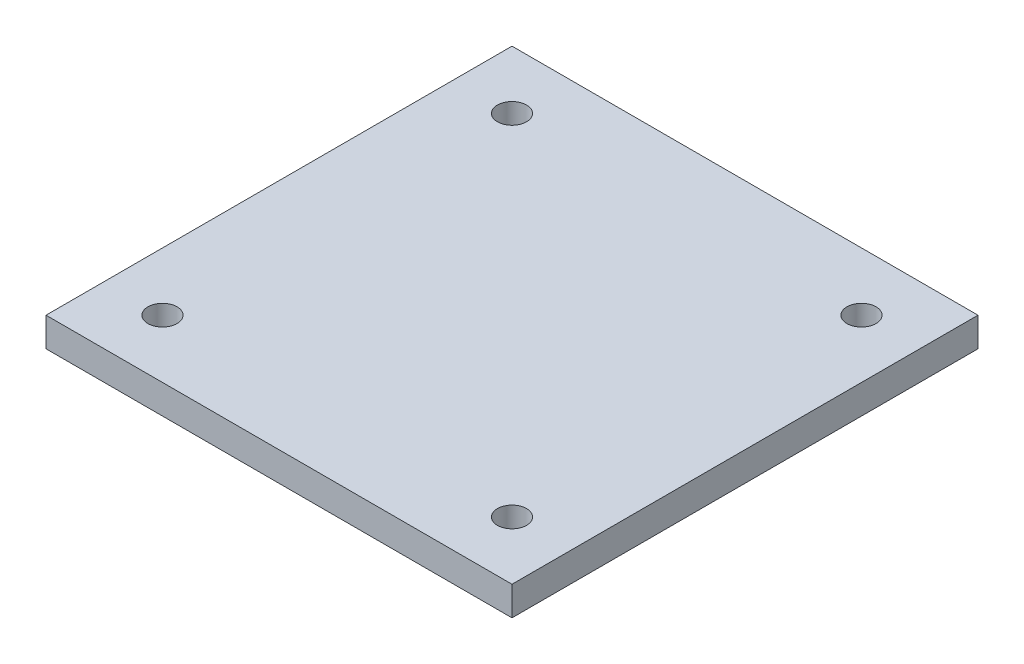
ISO-10303-21;
HEADER;
FILE_DESCRIPTION(('STEP AP214'),'2;1');
FILE_NAME('part.step','',(''),(''),'','','');
FILE_SCHEMA(('AUTOMOTIVE_DESIGN { 1 0 10303 214 1 1 1 1 }'));
ENDSEC;
DATA;
#1=APPLICATION_CONTEXT('core data for automotive mechanical design processes');
#2=APPLICATION_PROTOCOL_DEFINITION('international standard','automotive_design',2000,#1);
#3=PRODUCT_CONTEXT('',#1,'mechanical');
#4=PRODUCT('Part','Part','',(#3));
#5=PRODUCT_RELATED_PRODUCT_CATEGORY('part','',(#4));
#6=PRODUCT_DEFINITION_FORMATION('','',#4);
#7=PRODUCT_DEFINITION_CONTEXT('part definition',#1,'design');
#8=PRODUCT_DEFINITION('design','',#6,#7);
#9=PRODUCT_DEFINITION_SHAPE('','',#8);
#10=(LENGTH_UNIT() NAMED_UNIT(*) SI_UNIT(.MILLI.,.METRE.));
#11=(NAMED_UNIT(*) PLANE_ANGLE_UNIT() SI_UNIT($,.RADIAN.));
#12=(NAMED_UNIT(*) SI_UNIT($,.STERADIAN.) SOLID_ANGLE_UNIT());
#13=UNCERTAINTY_MEASURE_WITH_UNIT(LENGTH_MEASURE(1.E-05),#10,'distance_accuracy_value','');
#14=(GEOMETRIC_REPRESENTATION_CONTEXT(3) GLOBAL_UNCERTAINTY_ASSIGNED_CONTEXT((#13)) GLOBAL_UNIT_ASSIGNED_CONTEXT((#10,
#11,#12)) REPRESENTATION_CONTEXT('',''));
#15=CARTESIAN_POINT('',(0.,0.,0.));
#16=DIRECTION('',(0.,0.,1.));
#17=DIRECTION('',(1.,0.,0.));
#18=AXIS2_PLACEMENT_3D('',#15,#16,#17);
#19=CARTESIAN_POINT('',(0.,6.35,0.));
#20=DIRECTION('',(0.,-1.,0.));
#21=DIRECTION('',(0.,0.,-1.));
#22=AXIS2_PLACEMENT_3D('',#19,#20,#21);
#23=PLANE('',#22);
#24=DIRECTION('',(0.,0.,-1.));
#25=VECTOR('',#24,1.);
#26=CARTESIAN_POINT('',(50.8,6.35,50.8));
#27=LINE('',#26,#25);
#28=CARTESIAN_POINT('',(50.8,6.35,50.8));
#29=VERTEX_POINT('',#28);
#30=CARTESIAN_POINT('',(50.8,6.35,-50.8));
#31=VERTEX_POINT('',#30);
#32=EDGE_CURVE('E85',#29,#31,#27,.T.);
#33=ORIENTED_EDGE('',*,*,#32,.T.);
#34=DIRECTION('',(-1.,0.,0.));
#35=VECTOR('',#34,1.);
#36=CARTESIAN_POINT('',(-50.8,6.35,-50.8));
#37=LINE('',#36,#35);
#38=CARTESIAN_POINT('',(-50.8,6.35,-50.8));
#39=VERTEX_POINT('',#38);
#40=EDGE_CURVE('E80',#31,#39,#37,.T.);
#41=ORIENTED_EDGE('',*,*,#40,.T.);
#42=DIRECTION('',(0.,0.,1.));
#43=VECTOR('',#42,1.);
#44=CARTESIAN_POINT('',(-50.8,6.35,50.8));
#45=LINE('',#44,#43);
#46=CARTESIAN_POINT('',(-50.8,6.35,50.8));
#47=VERTEX_POINT('',#46);
#48=EDGE_CURVE('E83',#39,#47,#45,.T.);
#49=ORIENTED_EDGE('',*,*,#48,.T.);
#50=DIRECTION('',(1.,0.,0.));
#51=VECTOR('',#50,1.);
#52=CARTESIAN_POINT('',(-50.8,6.35,50.8));
#53=LINE('',#52,#51);
#54=EDGE_CURVE('E50',#47,#29,#53,.T.);
#55=ORIENTED_EDGE('',*,*,#54,.T.);
#56=EDGE_LOOP('',(#33,#41,#49,#55));
#57=FACE_BOUND('',#56,.T.);
#58=CARTESIAN_POINT('',(-38.1,6.35,-38.1));
#59=DIRECTION('',(0.,1.,0.));
#60=DIRECTION('',(0.,0.,1.));
#61=AXIS2_PLACEMENT_3D('',#58,#59,#60);
#62=CIRCLE('',#61,3.175);
#63=CARTESIAN_POINT('',(-38.1,6.35,-34.925));
#64=VERTEX_POINT('',#63);
#65=EDGE_CURVE('E100',#64,#64,#62,.T.);
#66=ORIENTED_EDGE('',*,*,#65,.F.);
#67=EDGE_LOOP('',(#66));
#68=FACE_BOUND('',#67,.T.);
#69=CARTESIAN_POINT('',(38.1,6.35,-38.1));
#70=DIRECTION('',(0.,1.,0.));
#71=DIRECTION('',(0.,0.,1.));
#72=AXIS2_PLACEMENT_3D('',#69,#70,#71);
#73=CIRCLE('',#72,3.175);
#74=CARTESIAN_POINT('',(38.1,6.35,-34.925));
#75=VERTEX_POINT('',#74);
#76=EDGE_CURVE('E115',#75,#75,#73,.T.);
#77=ORIENTED_EDGE('',*,*,#76,.F.);
#78=EDGE_LOOP('',(#77));
#79=FACE_BOUND('',#78,.T.);
#80=CARTESIAN_POINT('',(38.1000000000008,6.35,38.1));
#81=DIRECTION('',(0.,1.,0.));
#82=DIRECTION('',(0.,0.,1.));
#83=AXIS2_PLACEMENT_3D('',#80,#81,#82);
#84=CIRCLE('',#83,3.175);
#85=CARTESIAN_POINT('',(38.1000000000008,6.35,41.275));
#86=VERTEX_POINT('',#85);
#87=EDGE_CURVE('E121',#86,#86,#84,.T.);
#88=ORIENTED_EDGE('',*,*,#87,.F.);
#89=EDGE_LOOP('',(#88));
#90=FACE_BOUND('',#89,.T.);
#91=CARTESIAN_POINT('',(-38.0999999999992,6.35,38.1));
#92=DIRECTION('',(0.,1.,0.));
#93=DIRECTION('',(0.,0.,1.));
#94=AXIS2_PLACEMENT_3D('',#91,#92,#93);
#95=CIRCLE('',#94,3.175);
#96=CARTESIAN_POINT('',(-38.0999999999992,6.35,41.275));
#97=VERTEX_POINT('',#96);
#98=EDGE_CURVE('E127',#97,#97,#95,.T.);
#99=ORIENTED_EDGE('',*,*,#98,.F.);
#100=EDGE_LOOP('',(#99));
#101=FACE_BOUND('',#100,.T.);
#102=ADVANCED_FACE('F33',(#57,#68,#79,#90,#101),#23,.F.);
#103=CARTESIAN_POINT('',(0.,0.,0.));
#104=DIRECTION('',(0.,-1.,0.));
#105=DIRECTION('',(0.,0.,-1.));
#106=AXIS2_PLACEMENT_3D('',#103,#104,#105);
#107=PLANE('',#106);
#108=CARTESIAN_POINT('',(38.1000000000008,0.,38.1));
#109=DIRECTION('',(0.,1.,0.));
#110=DIRECTION('',(0.,0.,1.));
#111=AXIS2_PLACEMENT_3D('',#108,#109,#110);
#112=CIRCLE('',#111,3.175);
#113=CARTESIAN_POINT('',(38.1000000000008,0.,41.275));
#114=VERTEX_POINT('',#113);
#115=EDGE_CURVE('E124',#114,#114,#112,.T.);
#116=ORIENTED_EDGE('',*,*,#115,.T.);
#117=EDGE_LOOP('',(#116));
#118=FACE_BOUND('',#117,.T.);
#119=CARTESIAN_POINT('',(-38.1,0.,-38.1));
#120=DIRECTION('',(0.,1.,0.));
#121=DIRECTION('',(0.,0.,1.));
#122=AXIS2_PLACEMENT_3D('',#119,#120,#121);
#123=CIRCLE('',#122,3.175);
#124=CARTESIAN_POINT('',(-38.1,0.,-34.925));
#125=VERTEX_POINT('',#124);
#126=EDGE_CURVE('E112',#125,#125,#123,.T.);
#127=ORIENTED_EDGE('',*,*,#126,.T.);
#128=EDGE_LOOP('',(#127));
#129=FACE_BOUND('',#128,.T.);
#130=DIRECTION('',(0.,0.,-1.));
#131=VECTOR('',#130,1.);
#132=CARTESIAN_POINT('',(50.8,0.,50.8));
#133=LINE('',#132,#131);
#134=CARTESIAN_POINT('',(50.8,0.,50.8));
#135=VERTEX_POINT('',#134);
#136=CARTESIAN_POINT('',(50.8,0.,-50.8));
#137=VERTEX_POINT('',#136);
#138=EDGE_CURVE('E97',#135,#137,#133,.T.);
#139=ORIENTED_EDGE('',*,*,#138,.F.);
#140=DIRECTION('',(1.,0.,0.));
#141=VECTOR('',#140,1.);
#142=CARTESIAN_POINT('',(-50.8,0.,50.8));
#143=LINE('',#142,#141);
#144=CARTESIAN_POINT('',(-50.8,0.,50.8));
#145=VERTEX_POINT('',#144);
#146=EDGE_CURVE('E73',#145,#135,#143,.T.);
#147=ORIENTED_EDGE('',*,*,#146,.F.);
#148=DIRECTION('',(0.,0.,1.));
#149=VECTOR('',#148,1.);
#150=CARTESIAN_POINT('',(-50.8,0.,50.8));
#151=LINE('',#150,#149);
#152=CARTESIAN_POINT('',(-50.8,0.,-50.8));
#153=VERTEX_POINT('',#152);
#154=EDGE_CURVE('E67',#153,#145,#151,.T.);
#155=ORIENTED_EDGE('',*,*,#154,.F.);
#156=DIRECTION('',(-1.,0.,0.));
#157=VECTOR('',#156,1.);
#158=CARTESIAN_POINT('',(-50.8,0.,-50.8));
#159=LINE('',#158,#157);
#160=EDGE_CURVE('E89',#137,#153,#159,.T.);
#161=ORIENTED_EDGE('',*,*,#160,.F.);
#162=EDGE_LOOP('',(#139,#147,#155,#161));
#163=FACE_BOUND('',#162,.T.);
#164=CARTESIAN_POINT('',(38.1,0.,-38.1));
#165=DIRECTION('',(0.,1.,0.));
#166=DIRECTION('',(0.,0.,1.));
#167=AXIS2_PLACEMENT_3D('',#164,#165,#166);
#168=CIRCLE('',#167,3.175);
#169=CARTESIAN_POINT('',(38.1,0.,-34.925));
#170=VERTEX_POINT('',#169);
#171=EDGE_CURVE('E118',#170,#170,#168,.T.);
#172=ORIENTED_EDGE('',*,*,#171,.T.);
#173=EDGE_LOOP('',(#172));
#174=FACE_BOUND('',#173,.T.);
#175=CARTESIAN_POINT('',(-38.0999999999992,0.,38.1));
#176=DIRECTION('',(0.,1.,0.));
#177=DIRECTION('',(0.,0.,1.));
#178=AXIS2_PLACEMENT_3D('',#175,#176,#177);
#179=CIRCLE('',#178,3.175);
#180=CARTESIAN_POINT('',(-38.0999999999992,0.,41.275));
#181=VERTEX_POINT('',#180);
#182=EDGE_CURVE('E130',#181,#181,#179,.T.);
#183=ORIENTED_EDGE('',*,*,#182,.T.);
#184=EDGE_LOOP('',(#183));
#185=FACE_BOUND('',#184,.T.);
#186=ADVANCED_FACE('F108',(#118,#129,#163,#174,#185),#107,.T.);
#187=CARTESIAN_POINT('',(50.8,6.35,50.8));
#188=DIRECTION('',(-1.,0.,0.));
#189=DIRECTION('',(0.,0.,1.));
#190=AXIS2_PLACEMENT_3D('',#187,#188,#189);
#191=PLANE('',#190);
#192=ORIENTED_EDGE('',*,*,#138,.T.);
#193=DIRECTION('',(0.,-1.,0.));
#194=VECTOR('',#193,1.);
#195=CARTESIAN_POINT('',(50.8,6.35,-50.8));
#196=LINE('',#195,#194);
#197=EDGE_CURVE('E11',#31,#137,#196,.T.);
#198=ORIENTED_EDGE('',*,*,#197,.F.);
#199=ORIENTED_EDGE('',*,*,#32,.F.);
#200=DIRECTION('',(0.,-1.,0.));
#201=VECTOR('',#200,1.);
#202=CARTESIAN_POINT('',(50.8,6.35,50.8));
#203=LINE('',#202,#201);
#204=EDGE_CURVE('E93',#29,#135,#203,.T.);
#205=ORIENTED_EDGE('',*,*,#204,.T.);
#206=EDGE_LOOP('',(#192,#198,#199,#205));
#207=FACE_BOUND('',#206,.T.);
#208=ADVANCED_FACE('F35',(#207),#191,.F.);
#209=CARTESIAN_POINT('',(-50.8,6.35,-50.8));
#210=DIRECTION('',(0.,0.,1.));
#211=DIRECTION('',(1.,0.,0.));
#212=AXIS2_PLACEMENT_3D('',#209,#210,#211);
#213=PLANE('',#212);
#214=ORIENTED_EDGE('',*,*,#160,.T.);
#215=DIRECTION('',(0.,-1.,0.));
#216=VECTOR('',#215,1.);
#217=CARTESIAN_POINT('',(-50.8,6.35,-50.8));
#218=LINE('',#217,#216);
#219=EDGE_CURVE('E42',#39,#153,#218,.T.);
#220=ORIENTED_EDGE('',*,*,#219,.F.);
#221=ORIENTED_EDGE('',*,*,#40,.F.);
#222=ORIENTED_EDGE('',*,*,#197,.T.);
#223=EDGE_LOOP('',(#214,#220,#221,#222));
#224=FACE_BOUND('',#223,.T.);
#225=ADVANCED_FACE('F88',(#224),#213,.F.);
#226=CARTESIAN_POINT('',(-50.8,6.35,50.8));
#227=DIRECTION('',(1.,0.,0.));
#228=DIRECTION('',(0.,0.,-1.));
#229=AXIS2_PLACEMENT_3D('',#226,#227,#228);
#230=PLANE('',#229);
#231=ORIENTED_EDGE('',*,*,#154,.T.);
#232=DIRECTION('',(0.,-1.,0.));
#233=VECTOR('',#232,1.);
#234=CARTESIAN_POINT('',(-50.8,6.35,50.8));
#235=LINE('',#234,#233);
#236=EDGE_CURVE('E90',#47,#145,#235,.T.);
#237=ORIENTED_EDGE('',*,*,#236,.F.);
#238=ORIENTED_EDGE('',*,*,#48,.F.);
#239=ORIENTED_EDGE('',*,*,#219,.T.);
#240=EDGE_LOOP('',(#231,#237,#238,#239));
#241=FACE_BOUND('',#240,.T.);
#242=ADVANCED_FACE('F91',(#241),#230,.F.);
#243=CARTESIAN_POINT('',(-50.8,6.35,50.8));
#244=DIRECTION('',(0.,0.,-1.));
#245=DIRECTION('',(-1.,0.,0.));
#246=AXIS2_PLACEMENT_3D('',#243,#244,#245);
#247=PLANE('',#246);
#248=ORIENTED_EDGE('',*,*,#146,.T.);
#249=ORIENTED_EDGE('',*,*,#204,.F.);
#250=ORIENTED_EDGE('',*,*,#54,.F.);
#251=ORIENTED_EDGE('',*,*,#236,.T.);
#252=EDGE_LOOP('',(#248,#249,#250,#251));
#253=FACE_BOUND('',#252,.T.);
#254=ADVANCED_FACE('F105',(#253),#247,.F.);
#255=CARTESIAN_POINT('',(-38.1,6.35,-38.1));
#256=DIRECTION('',(0.,-1.,0.));
#257=DIRECTION('',(0.,0.,-1.));
#258=AXIS2_PLACEMENT_3D('',#255,#256,#257);
#259=CYLINDRICAL_SURFACE('',#258,3.175);
#260=ORIENTED_EDGE('',*,*,#65,.T.);
#261=EDGE_LOOP('',(#260));
#262=FACE_BOUND('',#261,.T.);
#263=ORIENTED_EDGE('',*,*,#126,.F.);
#264=EDGE_LOOP('',(#263));
#265=FACE_BOUND('',#264,.T.);
#266=ADVANCED_FACE('F147',(#262,#265),#259,.F.);
#267=CARTESIAN_POINT('',(38.1,6.35,-38.1));
#268=DIRECTION('',(0.,-1.,0.));
#269=DIRECTION('',(0.,0.,-1.));
#270=AXIS2_PLACEMENT_3D('',#267,#268,#269);
#271=CYLINDRICAL_SURFACE('',#270,3.175);
#272=ORIENTED_EDGE('',*,*,#76,.T.);
#273=EDGE_LOOP('',(#272));
#274=FACE_BOUND('',#273,.T.);
#275=ORIENTED_EDGE('',*,*,#171,.F.);
#276=EDGE_LOOP('',(#275));
#277=FACE_BOUND('',#276,.T.);
#278=ADVANCED_FACE('F193',(#274,#277),#271,.F.);
#279=CARTESIAN_POINT('',(38.1000000000008,6.35,38.1));
#280=DIRECTION('',(0.,-1.,0.));
#281=DIRECTION('',(0.,0.,-1.));
#282=AXIS2_PLACEMENT_3D('',#279,#280,#281);
#283=CYLINDRICAL_SURFACE('',#282,3.175);
#284=ORIENTED_EDGE('',*,*,#87,.T.);
#285=EDGE_LOOP('',(#284));
#286=FACE_BOUND('',#285,.T.);
#287=ORIENTED_EDGE('',*,*,#115,.F.);
#288=EDGE_LOOP('',(#287));
#289=FACE_BOUND('',#288,.T.);
#290=ADVANCED_FACE('F201',(#286,#289),#283,.F.);
#291=CARTESIAN_POINT('',(-38.0999999999992,6.35,38.1));
#292=DIRECTION('',(0.,-1.,0.));
#293=DIRECTION('',(0.,0.,-1.));
#294=AXIS2_PLACEMENT_3D('',#291,#292,#293);
#295=CYLINDRICAL_SURFACE('',#294,3.175);
#296=ORIENTED_EDGE('',*,*,#98,.T.);
#297=EDGE_LOOP('',(#296));
#298=FACE_BOUND('',#297,.T.);
#299=ORIENTED_EDGE('',*,*,#182,.F.);
#300=EDGE_LOOP('',(#299));
#301=FACE_BOUND('',#300,.T.);
#302=ADVANCED_FACE('F136',(#298,#301),#295,.F.);
#303=CLOSED_SHELL('',(#102,#186,#208,#225,#242,#254,#266,#278,#290,#302));
#304=MANIFOLD_SOLID_BREP('B2',#303);
#305=ADVANCED_BREP_SHAPE_REPRESENTATION('',(#18,#304),#14);
#306=SHAPE_DEFINITION_REPRESENTATION(#9,#305);
ENDSEC;
END-ISO-10303-21;
